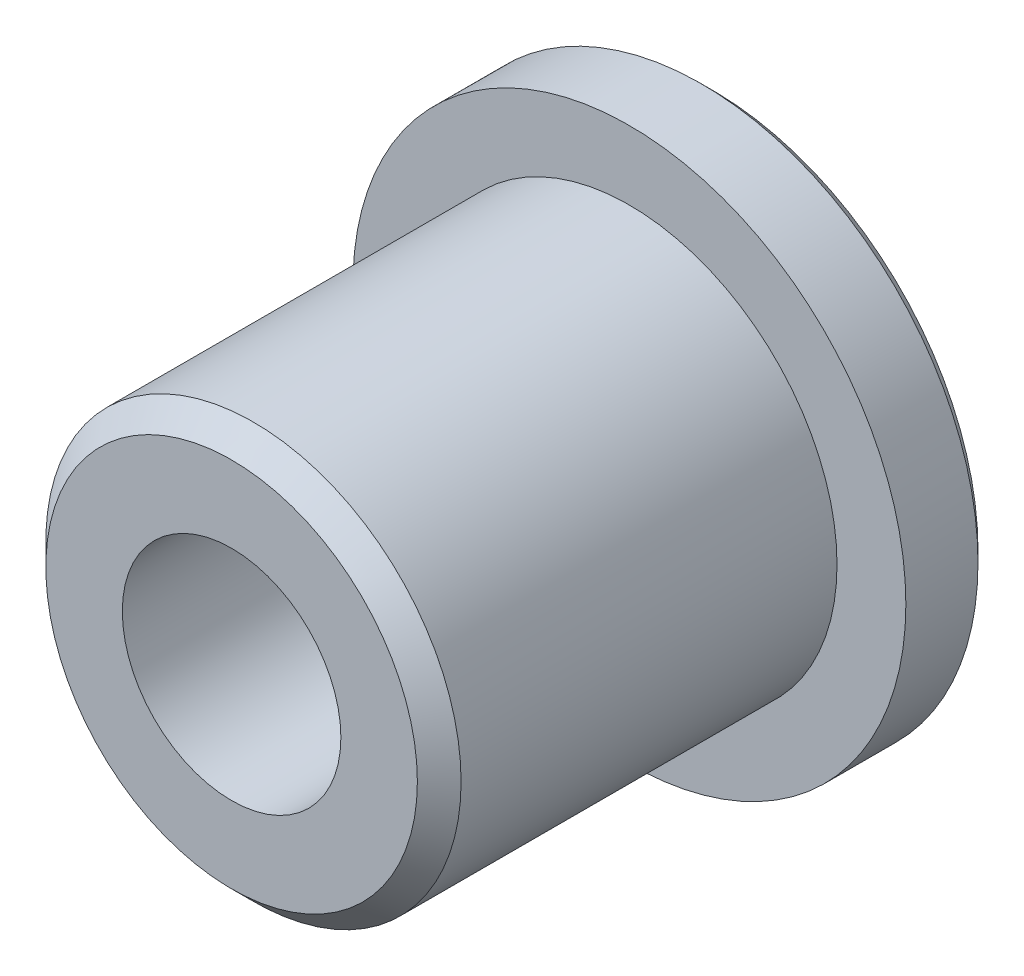
ISO-10303-21;
HEADER;
FILE_DESCRIPTION(('STEP AP214'),'2;1');
FILE_NAME('part.step','',(''),(''),'','','');
FILE_SCHEMA(('AUTOMOTIVE_DESIGN { 1 0 10303 214 1 1 1 1 }'));
ENDSEC;
DATA;
#1=APPLICATION_CONTEXT('core data for automotive mechanical design processes');
#2=APPLICATION_PROTOCOL_DEFINITION('international standard','automotive_design',2000,#1);
#3=PRODUCT_CONTEXT('',#1,'mechanical');
#4=PRODUCT('Part','Part','',(#3));
#5=PRODUCT_RELATED_PRODUCT_CATEGORY('part','',(#4));
#6=PRODUCT_DEFINITION_FORMATION('','',#4);
#7=PRODUCT_DEFINITION_CONTEXT('part definition',#1,'design');
#8=PRODUCT_DEFINITION('design','',#6,#7);
#9=PRODUCT_DEFINITION_SHAPE('','',#8);
#10=(LENGTH_UNIT() NAMED_UNIT(*) SI_UNIT(.MILLI.,.METRE.));
#11=(NAMED_UNIT(*) PLANE_ANGLE_UNIT() SI_UNIT($,.RADIAN.));
#12=(NAMED_UNIT(*) SI_UNIT($,.STERADIAN.) SOLID_ANGLE_UNIT());
#13=UNCERTAINTY_MEASURE_WITH_UNIT(LENGTH_MEASURE(1.E-05),#10,'distance_accuracy_value','');
#14=(GEOMETRIC_REPRESENTATION_CONTEXT(3) GLOBAL_UNCERTAINTY_ASSIGNED_CONTEXT((#13)) GLOBAL_UNIT_ASSIGNED_CONTEXT((#10,
#11,#12)) REPRESENTATION_CONTEXT('',''));
#15=CARTESIAN_POINT('',(0.,0.,0.));
#16=DIRECTION('',(0.,0.,1.));
#17=DIRECTION('',(1.,0.,0.));
#18=AXIS2_PLACEMENT_3D('',#15,#16,#17);
#19=CARTESIAN_POINT('',(0.,0.,4.));
#20=DIRECTION('',(0.,0.,-1.));
#21=DIRECTION('',(-1.,0.,0.));
#22=AXIS2_PLACEMENT_3D('',#19,#20,#21);
#23=CYLINDRICAL_SURFACE('',#22,3.);
#24=CARTESIAN_POINT('',(0.,0.,3.65000000000001));
#25=DIRECTION('',(0.,0.,1.));
#26=DIRECTION('',(1.,0.,0.));
#27=AXIS2_PLACEMENT_3D('',#24,#25,#26);
#28=CIRCLE('',#27,3.);
#29=CARTESIAN_POINT('',(3.,0.,3.65000000000001));
#30=VERTEX_POINT('',#29);
#31=EDGE_CURVE('E10',#30,#30,#28,.T.);
#32=ORIENTED_EDGE('',*,*,#31,.T.);
#33=EDGE_LOOP('',(#32));
#34=FACE_BOUND('',#33,.T.);
#35=CARTESIAN_POINT('',(0.,0.,2.8));
#36=DIRECTION('',(0.,0.,-1.));
#37=DIRECTION('',(-1.,0.,0.));
#38=AXIS2_PLACEMENT_3D('',#35,#36,#37);
#39=CIRCLE('',#38,3.);
#40=CARTESIAN_POINT('',(-3.,0.,2.8));
#41=VERTEX_POINT('',#40);
#42=EDGE_CURVE('E42',#41,#41,#39,.T.);
#43=ORIENTED_EDGE('',*,*,#42,.T.);
#44=EDGE_LOOP('',(#43));
#45=FACE_BOUND('',#44,.T.);
#46=ADVANCED_FACE('F31',(#34,#45),#23,.F.);
#47=CARTESIAN_POINT('',(0.,0.,22.));
#48=DIRECTION('',(0.,0.,-1.));
#49=DIRECTION('',(-1.,0.,0.));
#50=AXIS2_PLACEMENT_3D('',#47,#48,#49);
#51=CYLINDRICAL_SURFACE('',#50,5.);
#52=CARTESIAN_POINT('',(0.,0.,22.));
#53=DIRECTION('',(0.,0.,1.));
#54=DIRECTION('',(1.,0.,0.));
#55=AXIS2_PLACEMENT_3D('',#52,#53,#54);
#56=CIRCLE('',#55,5.);
#57=CARTESIAN_POINT('',(5.,0.,22.));
#58=VERTEX_POINT('',#57);
#59=EDGE_CURVE('E69',#58,#58,#56,.T.);
#60=ORIENTED_EDGE('',*,*,#59,.T.);
#61=EDGE_LOOP('',(#60));
#62=FACE_BOUND('',#61,.T.);
#63=CARTESIAN_POINT('',(0.,0.,4.));
#64=DIRECTION('',(0.,0.,-1.));
#65=DIRECTION('',(-1.,0.,0.));
#66=AXIS2_PLACEMENT_3D('',#63,#64,#65);
#67=CIRCLE('',#66,5.);
#68=CARTESIAN_POINT('',(-5.,0.,4.));
#69=VERTEX_POINT('',#68);
#70=EDGE_CURVE('E78',#69,#69,#67,.T.);
#71=ORIENTED_EDGE('',*,*,#70,.T.);
#72=EDGE_LOOP('',(#71));
#73=FACE_BOUND('',#72,.T.);
#74=ADVANCED_FACE('F104',(#62,#73),#51,.F.);
#75=CARTESIAN_POINT('',(0.,0.,0.));
#76=DIRECTION('',(0.,0.,1.));
#77=DIRECTION('',(1.,0.,0.));
#78=AXIS2_PLACEMENT_3D('',#75,#76,#77);
#79=PLANE('',#78);
#80=CARTESIAN_POINT('',(0.,0.,0.));
#81=DIRECTION('',(0.,0.,1.));
#82=DIRECTION('',(1.,0.,0.));
#83=AXIS2_PLACEMENT_3D('',#80,#81,#82);
#84=CIRCLE('',#83,12.15);
#85=CARTESIAN_POINT('',(12.15,0.,0.));
#86=VERTEX_POINT('',#85);
#87=EDGE_CURVE('E51',#86,#86,#84,.F.);
#88=ORIENTED_EDGE('',*,*,#87,.T.);
#89=EDGE_LOOP('',(#88));
#90=FACE_BOUND('',#89,.T.);
#91=CARTESIAN_POINT('',(0.,0.,0.));
#92=DIRECTION('',(0.,0.,1.));
#93=DIRECTION('',(1.,0.,0.));
#94=AXIS2_PLACEMENT_3D('',#91,#92,#93);
#95=CIRCLE('',#94,6.375);
#96=CARTESIAN_POINT('',(6.375,0.,0.));
#97=VERTEX_POINT('',#96);
#98=EDGE_CURVE('E66',#97,#97,#95,.T.);
#99=ORIENTED_EDGE('',*,*,#98,.T.);
#100=EDGE_LOOP('',(#99));
#101=FACE_BOUND('',#100,.T.);
#102=ADVANCED_FACE('F106',(#90,#101),#79,.F.);
#103=CARTESIAN_POINT('',(0.,0.,2.));
#104=DIRECTION('',(0.,0.,-1.));
#105=DIRECTION('',(-1.,0.,0.));
#106=AXIS2_PLACEMENT_3D('',#103,#104,#105);
#107=CYLINDRICAL_SURFACE('',#106,12.65);
#108=CARTESIAN_POINT('',(0.,0.,0.500000000000004));
#109=DIRECTION('',(0.,0.,1.));
#110=DIRECTION('',(1.,0.,0.));
#111=AXIS2_PLACEMENT_3D('',#108,#109,#110);
#112=CIRCLE('',#111,12.65);
#113=CARTESIAN_POINT('',(12.65,0.,0.500000000000004));
#114=VERTEX_POINT('',#113);
#115=EDGE_CURVE('E54',#114,#114,#112,.T.);
#116=ORIENTED_EDGE('',*,*,#115,.T.);
#117=EDGE_LOOP('',(#116));
#118=FACE_BOUND('',#117,.T.);
#119=CARTESIAN_POINT('',(0.,0.,3.8));
#120=DIRECTION('',(0.,0.,1.));
#121=DIRECTION('',(1.,0.,0.));
#122=AXIS2_PLACEMENT_3D('',#119,#120,#121);
#123=CIRCLE('',#122,12.65);
#124=CARTESIAN_POINT('',(12.65,0.,3.8));
#125=VERTEX_POINT('',#124);
#126=EDGE_CURVE('E72',#125,#125,#123,.T.);
#127=ORIENTED_EDGE('',*,*,#126,.F.);
#128=EDGE_LOOP('',(#127));
#129=FACE_BOUND('',#128,.T.);
#130=ADVANCED_FACE('F113',(#118,#129),#107,.T.);
#131=CARTESIAN_POINT('',(0.,0.,2.));
#132=DIRECTION('',(0.,0.,-1.));
#133=DIRECTION('',(-1.,0.,0.));
#134=AXIS2_PLACEMENT_3D('',#131,#132,#133);
#135=CYLINDRICAL_SURFACE('',#134,5.875);
#136=CARTESIAN_POINT('',(0.,0.,0.500000000000001));
#137=DIRECTION('',(0.,0.,1.));
#138=DIRECTION('',(1.,0.,0.));
#139=AXIS2_PLACEMENT_3D('',#136,#137,#138);
#140=CIRCLE('',#139,5.875);
#141=CARTESIAN_POINT('',(5.875,0.,0.500000000000001));
#142=VERTEX_POINT('',#141);
#143=EDGE_CURVE('E63',#142,#142,#140,.F.);
#144=ORIENTED_EDGE('',*,*,#143,.T.);
#145=EDGE_LOOP('',(#144));
#146=FACE_BOUND('',#145,.T.);
#147=CARTESIAN_POINT('',(0.,0.,2.));
#148=DIRECTION('',(0.,0.,-1.));
#149=DIRECTION('',(-1.,0.,0.));
#150=AXIS2_PLACEMENT_3D('',#147,#148,#149);
#151=CIRCLE('',#150,5.875);
#152=CARTESIAN_POINT('',(-5.875,0.,2.));
#153=VERTEX_POINT('',#152);
#154=EDGE_CURVE('E81',#153,#153,#151,.T.);
#155=ORIENTED_EDGE('',*,*,#154,.F.);
#156=EDGE_LOOP('',(#155));
#157=FACE_BOUND('',#156,.T.);
#158=ADVANCED_FACE('F124',(#146,#157),#135,.F.);
#159=CARTESIAN_POINT('',(0.,0.,22.));
#160=DIRECTION('',(0.,0.,1.));
#161=DIRECTION('',(1.,0.,0.));
#162=AXIS2_PLACEMENT_3D('',#159,#160,#161);
#163=PLANE('',#162);
#164=CARTESIAN_POINT('',(0.,0.,22.));
#165=DIRECTION('',(0.,0.,1.));
#166=DIRECTION('',(1.,0.,0.));
#167=AXIS2_PLACEMENT_3D('',#164,#165,#166);
#168=CIRCLE('',#167,8.49999999999999);
#169=CARTESIAN_POINT('',(8.49999999999999,0.,22.));
#170=VERTEX_POINT('',#169);
#171=EDGE_CURVE('E60',#170,#170,#168,.T.);
#172=ORIENTED_EDGE('',*,*,#171,.T.);
#173=EDGE_LOOP('',(#172));
#174=FACE_BOUND('',#173,.T.);
#175=ORIENTED_EDGE('',*,*,#59,.F.);
#176=EDGE_LOOP('',(#175));
#177=FACE_BOUND('',#176,.T.);
#178=ADVANCED_FACE('F120',(#174,#177),#163,.T.);
#179=CARTESIAN_POINT('',(0.,0.,22.));
#180=DIRECTION('',(0.,0.,-1.));
#181=DIRECTION('',(-1.,0.,0.));
#182=AXIS2_PLACEMENT_3D('',#179,#180,#181);
#183=CYLINDRICAL_SURFACE('',#182,9.5);
#184=CARTESIAN_POINT('',(0.,0.,21.));
#185=DIRECTION('',(0.,0.,1.));
#186=DIRECTION('',(1.,0.,0.));
#187=AXIS2_PLACEMENT_3D('',#184,#185,#186);
#188=CIRCLE('',#187,9.5);
#189=CARTESIAN_POINT('',(9.5,0.,21.));
#190=VERTEX_POINT('',#189);
#191=EDGE_CURVE('E57',#190,#190,#188,.F.);
#192=ORIENTED_EDGE('',*,*,#191,.T.);
#193=EDGE_LOOP('',(#192));
#194=FACE_BOUND('',#193,.T.);
#195=CARTESIAN_POINT('',(0.,0.,3.8));
#196=DIRECTION('',(0.,0.,1.));
#197=DIRECTION('',(1.,0.,0.));
#198=AXIS2_PLACEMENT_3D('',#195,#196,#197);
#199=CIRCLE('',#198,9.5);
#200=CARTESIAN_POINT('',(9.5,0.,3.8));
#201=VERTEX_POINT('',#200);
#202=EDGE_CURVE('E75',#201,#201,#199,.T.);
#203=ORIENTED_EDGE('',*,*,#202,.T.);
#204=EDGE_LOOP('',(#203));
#205=FACE_BOUND('',#204,.T.);
#206=ADVANCED_FACE('F123',(#194,#205),#183,.T.);
#207=CARTESIAN_POINT('',(0.,0.,0.));
#208=DIRECTION('',(0.,0.,-1.));
#209=DIRECTION('',(-1.,0.,0.));
#210=AXIS2_PLACEMENT_3D('',#207,#208,#209);
#211=CONICAL_SURFACE('',#210,6.375,0.785398163397444);
#212=ORIENTED_EDGE('',*,*,#143,.F.);
#213=EDGE_LOOP('',(#212));
#214=FACE_BOUND('',#213,.T.);
#215=ORIENTED_EDGE('',*,*,#98,.F.);
#216=EDGE_LOOP('',(#215));
#217=FACE_BOUND('',#216,.T.);
#218=ADVANCED_FACE('F128',(#214,#217),#211,.F.);
#219=CARTESIAN_POINT('',(0.,0.,3.8));
#220=DIRECTION('',(0.,0.,1.));
#221=DIRECTION('',(1.,0.,0.));
#222=AXIS2_PLACEMENT_3D('',#219,#220,#221);
#223=PLANE('',#222);
#224=ORIENTED_EDGE('',*,*,#126,.T.);
#225=EDGE_LOOP('',(#224));
#226=FACE_BOUND('',#225,.T.);
#227=ORIENTED_EDGE('',*,*,#202,.F.);
#228=EDGE_LOOP('',(#227));
#229=FACE_BOUND('',#228,.T.);
#230=ADVANCED_FACE('F119',(#226,#229),#223,.T.);
#231=CARTESIAN_POINT('',(0.,0.,22.));
#232=DIRECTION('',(0.,0.,-1.));
#233=DIRECTION('',(-1.,0.,0.));
#234=AXIS2_PLACEMENT_3D('',#231,#232,#233);
#235=CONICAL_SURFACE('',#234,8.49999999999999,0.785398163397449);
#236=ORIENTED_EDGE('',*,*,#191,.F.);
#237=EDGE_LOOP('',(#236));
#238=FACE_BOUND('',#237,.T.);
#239=ORIENTED_EDGE('',*,*,#171,.F.);
#240=EDGE_LOOP('',(#239));
#241=FACE_BOUND('',#240,.T.);
#242=ADVANCED_FACE('F139',(#238,#241),#235,.T.);
#243=CARTESIAN_POINT('',(0.,0.,0.500000000000004));
#244=DIRECTION('',(0.,0.,1.));
#245=DIRECTION('',(1.,0.,0.));
#246=AXIS2_PLACEMENT_3D('',#243,#244,#245);
#247=CONICAL_SURFACE('',#246,12.65,0.785398163397453);
#248=ORIENTED_EDGE('',*,*,#87,.F.);
#249=EDGE_LOOP('',(#248));
#250=FACE_BOUND('',#249,.T.);
#251=ORIENTED_EDGE('',*,*,#115,.F.);
#252=EDGE_LOOP('',(#251));
#253=FACE_BOUND('',#252,.T.);
#254=ADVANCED_FACE('F100',(#250,#253),#247,.T.);
#255=CARTESIAN_POINT('',(0.,0.,4.));
#256=DIRECTION('',(0.,0.,-1.));
#257=DIRECTION('',(-1.,0.,0.));
#258=AXIS2_PLACEMENT_3D('',#255,#256,#257);
#259=PLANE('',#258);
#260=CARTESIAN_POINT('',(0.,0.,4.));
#261=DIRECTION('',(0.,0.,1.));
#262=DIRECTION('',(1.,0.,0.));
#263=AXIS2_PLACEMENT_3D('',#260,#261,#262);
#264=CIRCLE('',#263,3.25);
#265=CARTESIAN_POINT('',(3.25,0.,4.));
#266=VERTEX_POINT('',#265);
#267=EDGE_CURVE('E88',#266,#266,#264,.T.);
#268=ORIENTED_EDGE('',*,*,#267,.F.);
#269=EDGE_LOOP('',(#268));
#270=FACE_BOUND('',#269,.T.);
#271=ORIENTED_EDGE('',*,*,#70,.F.);
#272=EDGE_LOOP('',(#271));
#273=FACE_BOUND('',#272,.T.);
#274=ADVANCED_FACE('F96',(#270,#273),#259,.F.);
#275=CARTESIAN_POINT('',(0.,0.,2.3));
#276=DIRECTION('',(0.,0.,-1.));
#277=DIRECTION('',(-1.,0.,0.));
#278=AXIS2_PLACEMENT_3D('',#275,#276,#277);
#279=PLANE('',#278);
#280=CARTESIAN_POINT('',(0.,0.,2.3));
#281=DIRECTION('',(0.,0.,-1.));
#282=DIRECTION('',(-1.,0.,0.));
#283=AXIS2_PLACEMENT_3D('',#280,#281,#282);
#284=CIRCLE('',#283,3.5);
#285=CARTESIAN_POINT('',(-3.5,0.,2.3));
#286=VERTEX_POINT('',#285);
#287=EDGE_CURVE('E46',#286,#286,#284,.F.);
#288=ORIENTED_EDGE('',*,*,#287,.T.);
#289=EDGE_LOOP('',(#288));
#290=FACE_BOUND('',#289,.T.);
#291=CARTESIAN_POINT('',(0.,0.,2.3));
#292=DIRECTION('',(0.,0.,-1.));
#293=DIRECTION('',(-1.,0.,0.));
#294=AXIS2_PLACEMENT_3D('',#291,#292,#293);
#295=CIRCLE('',#294,5.9);
#296=CARTESIAN_POINT('',(-5.9,0.,2.3));
#297=VERTEX_POINT('',#296);
#298=EDGE_CURVE('E84',#297,#297,#295,.T.);
#299=ORIENTED_EDGE('',*,*,#298,.T.);
#300=EDGE_LOOP('',(#299));
#301=FACE_BOUND('',#300,.T.);
#302=ADVANCED_FACE('F99',(#290,#301),#279,.T.);
#303=CARTESIAN_POINT('',(0.,0.,2.));
#304=DIRECTION('',(0.,0.,-1.));
#305=DIRECTION('',(-1.,0.,0.));
#306=AXIS2_PLACEMENT_3D('',#303,#304,#305);
#307=PLANE('',#306);
#308=ORIENTED_EDGE('',*,*,#154,.T.);
#309=EDGE_LOOP('',(#308));
#310=FACE_BOUND('',#309,.T.);
#311=CARTESIAN_POINT('',(0.,0.,2.));
#312=DIRECTION('',(0.,0.,-1.));
#313=DIRECTION('',(-1.,0.,0.));
#314=AXIS2_PLACEMENT_3D('',#311,#312,#313);
#315=CIRCLE('',#314,5.9);
#316=CARTESIAN_POINT('',(-5.9,0.,2.));
#317=VERTEX_POINT('',#316);
#318=EDGE_CURVE('E85',#317,#317,#315,.T.);
#319=ORIENTED_EDGE('',*,*,#318,.F.);
#320=EDGE_LOOP('',(#319));
#321=FACE_BOUND('',#320,.T.);
#322=ADVANCED_FACE('F154',(#310,#321),#307,.F.);
#323=CARTESIAN_POINT('',(0.,0.,2.3));
#324=DIRECTION('',(0.,0.,-1.));
#325=DIRECTION('',(-1.,0.,0.));
#326=AXIS2_PLACEMENT_3D('',#323,#324,#325);
#327=CYLINDRICAL_SURFACE('',#326,5.9);
#328=ORIENTED_EDGE('',*,*,#298,.F.);
#329=EDGE_LOOP('',(#328));
#330=FACE_BOUND('',#329,.T.);
#331=ORIENTED_EDGE('',*,*,#318,.T.);
#332=EDGE_LOOP('',(#331));
#333=FACE_BOUND('',#332,.T.);
#334=ADVANCED_FACE('F147',(#330,#333),#327,.F.);
#335=CARTESIAN_POINT('',(0.,0.,2.3));
#336=DIRECTION('',(0.,0.,-1.));
#337=DIRECTION('',(-1.,0.,0.));
#338=AXIS2_PLACEMENT_3D('',#335,#336,#337);
#339=CONICAL_SURFACE('',#338,3.5,0.785398163397449);
#340=ORIENTED_EDGE('',*,*,#42,.F.);
#341=EDGE_LOOP('',(#340));
#342=FACE_BOUND('',#341,.T.);
#343=ORIENTED_EDGE('',*,*,#287,.F.);
#344=EDGE_LOOP('',(#343));
#345=FACE_BOUND('',#344,.T.);
#346=ADVANCED_FACE('F145',(#342,#345),#339,.F.);
#347=CARTESIAN_POINT('',(0.,0.,3.4));
#348=DIRECTION('',(0.,0.,1.));
#349=DIRECTION('',(1.,0.,0.));
#350=AXIS2_PLACEMENT_3D('',#347,#348,#349);
#351=CYLINDRICAL_SURFACE('',#350,3.25);
#352=CARTESIAN_POINT('',(0.,0.,3.9));
#353=DIRECTION('',(0.,0.,1.));
#354=DIRECTION('',(1.,0.,0.));
#355=AXIS2_PLACEMENT_3D('',#352,#353,#354);
#356=CIRCLE('',#355,3.25);
#357=CARTESIAN_POINT('',(3.25,0.,3.9));
#358=VERTEX_POINT('',#357);
#359=EDGE_CURVE('E38',#358,#358,#356,.F.);
#360=ORIENTED_EDGE('',*,*,#359,.T.);
#361=EDGE_LOOP('',(#360));
#362=FACE_BOUND('',#361,.T.);
#363=ORIENTED_EDGE('',*,*,#267,.T.);
#364=EDGE_LOOP('',(#363));
#365=FACE_BOUND('',#364,.T.);
#366=ADVANCED_FACE('F94',(#362,#365),#351,.F.);
#367=CARTESIAN_POINT('',(0.,0.,3.4));
#368=DIRECTION('',(0.,0.,1.));
#369=DIRECTION('',(1.,0.,0.));
#370=AXIS2_PLACEMENT_3D('',#367,#368,#369);
#371=CONICAL_SURFACE('',#370,2.74999999999999,0.785398163397453);
#372=ORIENTED_EDGE('',*,*,#359,.F.);
#373=EDGE_LOOP('',(#372));
#374=FACE_BOUND('',#373,.T.);
#375=ORIENTED_EDGE('',*,*,#31,.F.);
#376=EDGE_LOOP('',(#375));
#377=FACE_BOUND('',#376,.T.);
#378=ADVANCED_FACE('F33',(#374,#377),#371,.F.);
#379=CLOSED_SHELL('',(#46,#74,#102,#130,#158,#178,#206,#218,#230,#242,#254,#274,#302,#322,#334,
#346,#366,#378));
#380=MANIFOLD_SOLID_BREP('B2',#379);
#381=ADVANCED_BREP_SHAPE_REPRESENTATION('',(#18,#380),#14);
#382=SHAPE_DEFINITION_REPRESENTATION(#9,#381);
ENDSEC;
END-ISO-10303-21;
